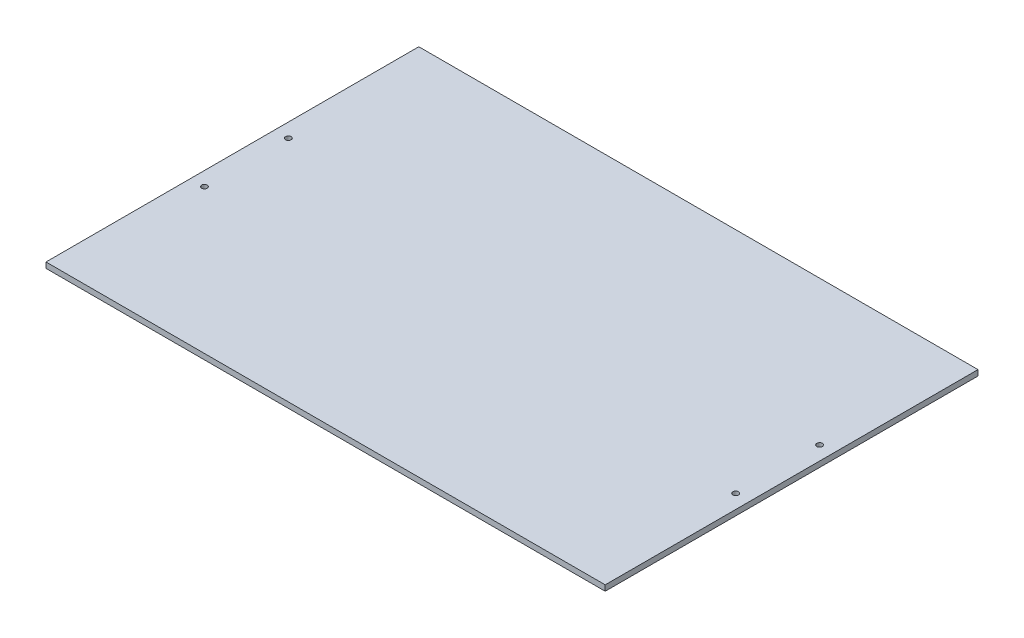
ISO-10303-21;
HEADER;
FILE_DESCRIPTION(('STEP AP214'),'2;1');
FILE_NAME('part.step','',(''),(''),'','','');
FILE_SCHEMA(('AUTOMOTIVE_DESIGN { 1 0 10303 214 1 1 1 1 }'));
ENDSEC;
DATA;
#1=APPLICATION_CONTEXT('core data for automotive mechanical design processes');
#2=APPLICATION_PROTOCOL_DEFINITION('international standard','automotive_design',2000,#1);
#3=PRODUCT_CONTEXT('',#1,'mechanical');
#4=PRODUCT('Part','Part','',(#3));
#5=PRODUCT_RELATED_PRODUCT_CATEGORY('part','',(#4));
#6=PRODUCT_DEFINITION_FORMATION('','',#4);
#7=PRODUCT_DEFINITION_CONTEXT('part definition',#1,'design');
#8=PRODUCT_DEFINITION('design','',#6,#7);
#9=PRODUCT_DEFINITION_SHAPE('','',#8);
#10=(LENGTH_UNIT() NAMED_UNIT(*) SI_UNIT(.MILLI.,.METRE.));
#11=(NAMED_UNIT(*) PLANE_ANGLE_UNIT() SI_UNIT($,.RADIAN.));
#12=(NAMED_UNIT(*) SI_UNIT($,.STERADIAN.) SOLID_ANGLE_UNIT());
#13=UNCERTAINTY_MEASURE_WITH_UNIT(LENGTH_MEASURE(1.E-05),#10,'distance_accuracy_value','');
#14=(GEOMETRIC_REPRESENTATION_CONTEXT(3) GLOBAL_UNCERTAINTY_ASSIGNED_CONTEXT((#13)) GLOBAL_UNIT_ASSIGNED_CONTEXT((#10,
#11,#12)) REPRESENTATION_CONTEXT('',''));
#15=CARTESIAN_POINT('',(0.,0.,0.));
#16=DIRECTION('',(0.,0.,1.));
#17=DIRECTION('',(1.,0.,0.));
#18=AXIS2_PLACEMENT_3D('',#15,#16,#17);
#19=CARTESIAN_POINT('',(0.,3.,0.));
#20=DIRECTION('',(0.,-1.,0.));
#21=DIRECTION('',(0.,0.,-1.));
#22=AXIS2_PLACEMENT_3D('',#19,#20,#21);
#23=PLANE('',#22);
#24=DIRECTION('',(0.,0.,-1.));
#25=VECTOR('',#24,1.);
#26=CARTESIAN_POINT('',(150.,3.,100.));
#27=LINE('',#26,#25);
#28=CARTESIAN_POINT('',(150.,3.,100.));
#29=VERTEX_POINT('',#28);
#30=CARTESIAN_POINT('',(150.,3.,-100.));
#31=VERTEX_POINT('',#30);
#32=EDGE_CURVE('E87',#29,#31,#27,.T.);
#33=ORIENTED_EDGE('',*,*,#32,.T.);
#34=DIRECTION('',(-1.,0.,0.));
#35=VECTOR('',#34,1.);
#36=CARTESIAN_POINT('',(-150.,3.,-100.));
#37=LINE('',#36,#35);
#38=CARTESIAN_POINT('',(-150.,3.,-100.));
#39=VERTEX_POINT('',#38);
#40=EDGE_CURVE('E82',#31,#39,#37,.T.);
#41=ORIENTED_EDGE('',*,*,#40,.T.);
#42=DIRECTION('',(0.,0.,1.));
#43=VECTOR('',#42,1.);
#44=CARTESIAN_POINT('',(-150.,3.,100.));
#45=LINE('',#44,#43);
#46=CARTESIAN_POINT('',(-150.,3.,100.));
#47=VERTEX_POINT('',#46);
#48=EDGE_CURVE('E85',#39,#47,#45,.T.);
#49=ORIENTED_EDGE('',*,*,#48,.T.);
#50=DIRECTION('',(1.,0.,0.));
#51=VECTOR('',#50,1.);
#52=CARTESIAN_POINT('',(-150.,3.,100.));
#53=LINE('',#52,#51);
#54=EDGE_CURVE('E52',#47,#29,#53,.T.);
#55=ORIENTED_EDGE('',*,*,#54,.T.);
#56=EDGE_LOOP('',(#33,#41,#49,#55));
#57=FACE_BOUND('',#56,.T.);
#58=CARTESIAN_POINT('',(-142.5,3.,-22.5));
#59=DIRECTION('',(0.,1.,0.));
#60=DIRECTION('',(0.,0.,1.));
#61=AXIS2_PLACEMENT_3D('',#58,#59,#60);
#62=CIRCLE('',#61,1.5);
#63=CARTESIAN_POINT('',(-142.5,3.,-21.));
#64=VERTEX_POINT('',#63);
#65=EDGE_CURVE('E102',#64,#64,#62,.T.);
#66=ORIENTED_EDGE('',*,*,#65,.F.);
#67=EDGE_LOOP('',(#66));
#68=FACE_BOUND('',#67,.T.);
#69=CARTESIAN_POINT('',(-142.5,3.,22.5));
#70=DIRECTION('',(0.,1.,0.));
#71=DIRECTION('',(0.,0.,1.));
#72=AXIS2_PLACEMENT_3D('',#69,#70,#71);
#73=CIRCLE('',#72,1.5);
#74=CARTESIAN_POINT('',(-142.5,3.,24.));
#75=VERTEX_POINT('',#74);
#76=EDGE_CURVE('E117',#75,#75,#73,.T.);
#77=ORIENTED_EDGE('',*,*,#76,.F.);
#78=EDGE_LOOP('',(#77));
#79=FACE_BOUND('',#78,.T.);
#80=CARTESIAN_POINT('',(142.5,3.,22.5000000000001));
#81=DIRECTION('',(0.,1.,0.));
#82=DIRECTION('',(0.,0.,-1.));
#83=AXIS2_PLACEMENT_3D('',#80,#81,#82);
#84=CIRCLE('',#83,1.5);
#85=CARTESIAN_POINT('',(142.5,3.,21.0000000000001));
#86=VERTEX_POINT('',#85);
#87=EDGE_CURVE('E123',#86,#86,#84,.T.);
#88=ORIENTED_EDGE('',*,*,#87,.F.);
#89=EDGE_LOOP('',(#88));
#90=FACE_BOUND('',#89,.T.);
#91=CARTESIAN_POINT('',(142.5,3.,-22.5));
#92=DIRECTION('',(0.,1.,0.));
#93=DIRECTION('',(0.,0.,-1.));
#94=AXIS2_PLACEMENT_3D('',#91,#92,#93);
#95=CIRCLE('',#94,1.5);
#96=CARTESIAN_POINT('',(142.5,3.,-24.));
#97=VERTEX_POINT('',#96);
#98=EDGE_CURVE('E129',#97,#97,#95,.T.);
#99=ORIENTED_EDGE('',*,*,#98,.F.);
#100=EDGE_LOOP('',(#99));
#101=FACE_BOUND('',#100,.T.);
#102=ADVANCED_FACE('F35',(#57,#68,#79,#90,#101),#23,.F.);
#103=CARTESIAN_POINT('',(0.,0.,0.));
#104=DIRECTION('',(0.,-1.,0.));
#105=DIRECTION('',(0.,0.,-1.));
#106=AXIS2_PLACEMENT_3D('',#103,#104,#105);
#107=PLANE('',#106);
#108=CARTESIAN_POINT('',(142.5,0.,22.5000000000001));
#109=DIRECTION('',(0.,1.,0.));
#110=DIRECTION('',(0.,0.,-1.));
#111=AXIS2_PLACEMENT_3D('',#108,#109,#110);
#112=CIRCLE('',#111,1.5);
#113=CARTESIAN_POINT('',(142.5,0.,21.0000000000001));
#114=VERTEX_POINT('',#113);
#115=EDGE_CURVE('E126',#114,#114,#112,.T.);
#116=ORIENTED_EDGE('',*,*,#115,.T.);
#117=EDGE_LOOP('',(#116));
#118=FACE_BOUND('',#117,.T.);
#119=CARTESIAN_POINT('',(-142.5,0.,-22.5));
#120=DIRECTION('',(0.,1.,0.));
#121=DIRECTION('',(0.,0.,1.));
#122=AXIS2_PLACEMENT_3D('',#119,#120,#121);
#123=CIRCLE('',#122,1.5);
#124=CARTESIAN_POINT('',(-142.5,0.,-21.));
#125=VERTEX_POINT('',#124);
#126=EDGE_CURVE('E114',#125,#125,#123,.T.);
#127=ORIENTED_EDGE('',*,*,#126,.T.);
#128=EDGE_LOOP('',(#127));
#129=FACE_BOUND('',#128,.T.);
#130=DIRECTION('',(0.,0.,-1.));
#131=VECTOR('',#130,1.);
#132=CARTESIAN_POINT('',(150.,0.,100.));
#133=LINE('',#132,#131);
#134=CARTESIAN_POINT('',(150.,0.,100.));
#135=VERTEX_POINT('',#134);
#136=CARTESIAN_POINT('',(150.,0.,-100.));
#137=VERTEX_POINT('',#136);
#138=EDGE_CURVE('E99',#135,#137,#133,.T.);
#139=ORIENTED_EDGE('',*,*,#138,.F.);
#140=DIRECTION('',(1.,0.,0.));
#141=VECTOR('',#140,1.);
#142=CARTESIAN_POINT('',(-150.,0.,100.));
#143=LINE('',#142,#141);
#144=CARTESIAN_POINT('',(-150.,0.,100.));
#145=VERTEX_POINT('',#144);
#146=EDGE_CURVE('E75',#145,#135,#143,.T.);
#147=ORIENTED_EDGE('',*,*,#146,.F.);
#148=DIRECTION('',(0.,0.,1.));
#149=VECTOR('',#148,1.);
#150=CARTESIAN_POINT('',(-150.,0.,100.));
#151=LINE('',#150,#149);
#152=CARTESIAN_POINT('',(-150.,0.,-100.));
#153=VERTEX_POINT('',#152);
#154=EDGE_CURVE('E69',#153,#145,#151,.T.);
#155=ORIENTED_EDGE('',*,*,#154,.F.);
#156=DIRECTION('',(-1.,0.,0.));
#157=VECTOR('',#156,1.);
#158=CARTESIAN_POINT('',(-150.,0.,-100.));
#159=LINE('',#158,#157);
#160=EDGE_CURVE('E91',#137,#153,#159,.T.);
#161=ORIENTED_EDGE('',*,*,#160,.F.);
#162=EDGE_LOOP('',(#139,#147,#155,#161));
#163=FACE_BOUND('',#162,.T.);
#164=CARTESIAN_POINT('',(-142.5,0.,22.5));
#165=DIRECTION('',(0.,1.,0.));
#166=DIRECTION('',(0.,0.,1.));
#167=AXIS2_PLACEMENT_3D('',#164,#165,#166);
#168=CIRCLE('',#167,1.5);
#169=CARTESIAN_POINT('',(-142.5,0.,24.));
#170=VERTEX_POINT('',#169);
#171=EDGE_CURVE('E120',#170,#170,#168,.T.);
#172=ORIENTED_EDGE('',*,*,#171,.T.);
#173=EDGE_LOOP('',(#172));
#174=FACE_BOUND('',#173,.T.);
#175=CARTESIAN_POINT('',(142.5,0.,-22.5));
#176=DIRECTION('',(0.,1.,0.));
#177=DIRECTION('',(0.,0.,-1.));
#178=AXIS2_PLACEMENT_3D('',#175,#176,#177);
#179=CIRCLE('',#178,1.5);
#180=CARTESIAN_POINT('',(142.5,0.,-24.));
#181=VERTEX_POINT('',#180);
#182=EDGE_CURVE('E132',#181,#181,#179,.T.);
#183=ORIENTED_EDGE('',*,*,#182,.T.);
#184=EDGE_LOOP('',(#183));
#185=FACE_BOUND('',#184,.T.);
#186=ADVANCED_FACE('F110',(#118,#129,#163,#174,#185),#107,.T.);
#187=CARTESIAN_POINT('',(150.,3.,100.));
#188=DIRECTION('',(-1.,0.,0.));
#189=DIRECTION('',(0.,0.,1.));
#190=AXIS2_PLACEMENT_3D('',#187,#188,#189);
#191=PLANE('',#190);
#192=ORIENTED_EDGE('',*,*,#138,.T.);
#193=DIRECTION('',(0.,-1.,0.));
#194=VECTOR('',#193,1.);
#195=CARTESIAN_POINT('',(150.,3.,-100.));
#196=LINE('',#195,#194);
#197=EDGE_CURVE('E11',#31,#137,#196,.T.);
#198=ORIENTED_EDGE('',*,*,#197,.F.);
#199=ORIENTED_EDGE('',*,*,#32,.F.);
#200=DIRECTION('',(0.,-1.,0.));
#201=VECTOR('',#200,1.);
#202=CARTESIAN_POINT('',(150.,3.,100.));
#203=LINE('',#202,#201);
#204=EDGE_CURVE('E95',#29,#135,#203,.T.);
#205=ORIENTED_EDGE('',*,*,#204,.T.);
#206=EDGE_LOOP('',(#192,#198,#199,#205));
#207=FACE_BOUND('',#206,.T.);
#208=ADVANCED_FACE('F37',(#207),#191,.F.);
#209=CARTESIAN_POINT('',(-150.,3.,-100.));
#210=DIRECTION('',(0.,0.,1.));
#211=DIRECTION('',(1.,0.,0.));
#212=AXIS2_PLACEMENT_3D('',#209,#210,#211);
#213=PLANE('',#212);
#214=ORIENTED_EDGE('',*,*,#160,.T.);
#215=DIRECTION('',(0.,-1.,0.));
#216=VECTOR('',#215,1.);
#217=CARTESIAN_POINT('',(-150.,3.,-100.));
#218=LINE('',#217,#216);
#219=EDGE_CURVE('E44',#39,#153,#218,.T.);
#220=ORIENTED_EDGE('',*,*,#219,.F.);
#221=ORIENTED_EDGE('',*,*,#40,.F.);
#222=ORIENTED_EDGE('',*,*,#197,.T.);
#223=EDGE_LOOP('',(#214,#220,#221,#222));
#224=FACE_BOUND('',#223,.T.);
#225=ADVANCED_FACE('F90',(#224),#213,.F.);
#226=CARTESIAN_POINT('',(-150.,3.,100.));
#227=DIRECTION('',(1.,0.,0.));
#228=DIRECTION('',(0.,0.,-1.));
#229=AXIS2_PLACEMENT_3D('',#226,#227,#228);
#230=PLANE('',#229);
#231=ORIENTED_EDGE('',*,*,#154,.T.);
#232=DIRECTION('',(0.,-1.,0.));
#233=VECTOR('',#232,1.);
#234=CARTESIAN_POINT('',(-150.,3.,100.));
#235=LINE('',#234,#233);
#236=EDGE_CURVE('E92',#47,#145,#235,.T.);
#237=ORIENTED_EDGE('',*,*,#236,.F.);
#238=ORIENTED_EDGE('',*,*,#48,.F.);
#239=ORIENTED_EDGE('',*,*,#219,.T.);
#240=EDGE_LOOP('',(#231,#237,#238,#239));
#241=FACE_BOUND('',#240,.T.);
#242=ADVANCED_FACE('F93',(#241),#230,.F.);
#243=CARTESIAN_POINT('',(-150.,3.,100.));
#244=DIRECTION('',(0.,0.,-1.));
#245=DIRECTION('',(-1.,0.,0.));
#246=AXIS2_PLACEMENT_3D('',#243,#244,#245);
#247=PLANE('',#246);
#248=ORIENTED_EDGE('',*,*,#146,.T.);
#249=ORIENTED_EDGE('',*,*,#204,.F.);
#250=ORIENTED_EDGE('',*,*,#54,.F.);
#251=ORIENTED_EDGE('',*,*,#236,.T.);
#252=EDGE_LOOP('',(#248,#249,#250,#251));
#253=FACE_BOUND('',#252,.T.);
#254=ADVANCED_FACE('F107',(#253),#247,.F.);
#255=CARTESIAN_POINT('',(-142.5,3.,-22.5));
#256=DIRECTION('',(0.,-1.,0.));
#257=DIRECTION('',(0.,0.,-1.));
#258=AXIS2_PLACEMENT_3D('',#255,#256,#257);
#259=CYLINDRICAL_SURFACE('',#258,1.5);
#260=ORIENTED_EDGE('',*,*,#65,.T.);
#261=EDGE_LOOP('',(#260));
#262=FACE_BOUND('',#261,.T.);
#263=ORIENTED_EDGE('',*,*,#126,.F.);
#264=EDGE_LOOP('',(#263));
#265=FACE_BOUND('',#264,.T.);
#266=ADVANCED_FACE('F149',(#262,#265),#259,.F.);
#267=CARTESIAN_POINT('',(-142.5,3.,22.5));
#268=DIRECTION('',(0.,-1.,0.));
#269=DIRECTION('',(0.,0.,-1.));
#270=AXIS2_PLACEMENT_3D('',#267,#268,#269);
#271=CYLINDRICAL_SURFACE('',#270,1.5);
#272=ORIENTED_EDGE('',*,*,#76,.T.);
#273=EDGE_LOOP('',(#272));
#274=FACE_BOUND('',#273,.T.);
#275=ORIENTED_EDGE('',*,*,#171,.F.);
#276=EDGE_LOOP('',(#275));
#277=FACE_BOUND('',#276,.T.);
#278=ADVANCED_FACE('F195',(#274,#277),#271,.F.);
#279=CARTESIAN_POINT('',(142.5,3.,22.5000000000001));
#280=DIRECTION('',(0.,-1.,0.));
#281=DIRECTION('',(0.,0.,-1.));
#282=AXIS2_PLACEMENT_3D('',#279,#280,#281);
#283=CYLINDRICAL_SURFACE('',#282,1.5);
#284=ORIENTED_EDGE('',*,*,#87,.T.);
#285=EDGE_LOOP('',(#284));
#286=FACE_BOUND('',#285,.T.);
#287=ORIENTED_EDGE('',*,*,#115,.F.);
#288=EDGE_LOOP('',(#287));
#289=FACE_BOUND('',#288,.T.);
#290=ADVANCED_FACE('F203',(#286,#289),#283,.F.);
#291=CARTESIAN_POINT('',(142.5,3.,-22.5));
#292=DIRECTION('',(0.,-1.,0.));
#293=DIRECTION('',(0.,0.,-1.));
#294=AXIS2_PLACEMENT_3D('',#291,#292,#293);
#295=CYLINDRICAL_SURFACE('',#294,1.5);
#296=ORIENTED_EDGE('',*,*,#98,.T.);
#297=EDGE_LOOP('',(#296));
#298=FACE_BOUND('',#297,.T.);
#299=ORIENTED_EDGE('',*,*,#182,.F.);
#300=EDGE_LOOP('',(#299));
#301=FACE_BOUND('',#300,.T.);
#302=ADVANCED_FACE('F138',(#298,#301),#295,.F.);
#303=CLOSED_SHELL('',(#102,#186,#208,#225,#242,#254,#266,#278,#290,#302));
#304=MANIFOLD_SOLID_BREP('B2',#303);
#305=ADVANCED_BREP_SHAPE_REPRESENTATION('',(#18,#304),#14);
#306=SHAPE_DEFINITION_REPRESENTATION(#9,#305);
ENDSEC;
END-ISO-10303-21;
